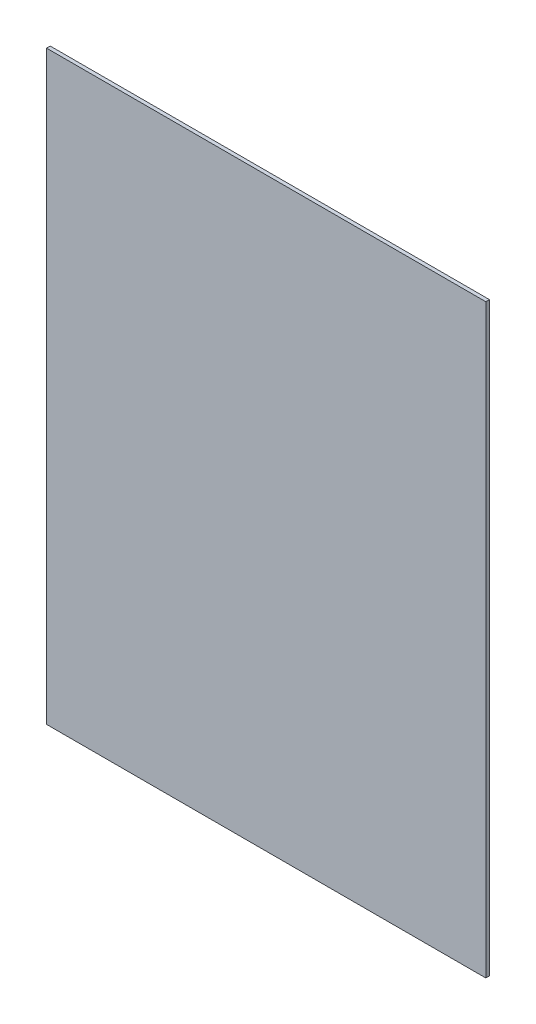
ISO-10303-21;
HEADER;
FILE_DESCRIPTION(('STEP AP214'),'2;1');
FILE_NAME('part.step','',(''),(''),'','','');
FILE_SCHEMA(('AUTOMOTIVE_DESIGN { 1 0 10303 214 1 1 1 1 }'));
ENDSEC;
DATA;
#1=APPLICATION_CONTEXT('core data for automotive mechanical design processes');
#2=APPLICATION_PROTOCOL_DEFINITION('international standard','automotive_design',2000,#1);
#3=PRODUCT_CONTEXT('',#1,'mechanical');
#4=PRODUCT('Part','Part','',(#3));
#5=PRODUCT_RELATED_PRODUCT_CATEGORY('part','',(#4));
#6=PRODUCT_DEFINITION_FORMATION('','',#4);
#7=PRODUCT_DEFINITION_CONTEXT('part definition',#1,'design');
#8=PRODUCT_DEFINITION('design','',#6,#7);
#9=PRODUCT_DEFINITION_SHAPE('','',#8);
#10=(LENGTH_UNIT() NAMED_UNIT(*) SI_UNIT(.MILLI.,.METRE.));
#11=(NAMED_UNIT(*) PLANE_ANGLE_UNIT() SI_UNIT($,.RADIAN.));
#12=(NAMED_UNIT(*) SI_UNIT($,.STERADIAN.) SOLID_ANGLE_UNIT());
#13=UNCERTAINTY_MEASURE_WITH_UNIT(LENGTH_MEASURE(1.E-05),#10,'distance_accuracy_value','');
#14=(GEOMETRIC_REPRESENTATION_CONTEXT(3) GLOBAL_UNCERTAINTY_ASSIGNED_CONTEXT((#13)) GLOBAL_UNIT_ASSIGNED_CONTEXT((#10,
#11,#12)) REPRESENTATION_CONTEXT('',''));
#15=CARTESIAN_POINT('',(0.,0.,0.));
#16=DIRECTION('',(0.,0.,1.));
#17=DIRECTION('',(1.,0.,0.));
#18=AXIS2_PLACEMENT_3D('',#15,#16,#17);
#19=CARTESIAN_POINT('',(0.,0.,5.));
#20=DIRECTION('',(1.,0.,0.));
#21=DIRECTION('',(0.,0.,-1.));
#22=AXIS2_PLACEMENT_3D('',#19,#20,#21);
#23=PLANE('',#22);
#24=DIRECTION('',(0.,-1.,0.));
#25=VECTOR('',#24,1.);
#26=CARTESIAN_POINT('',(0.,0.,0.));
#27=LINE('',#26,#25);
#28=CARTESIAN_POINT('',(0.,800.,0.));
#29=VERTEX_POINT('',#28);
#30=CARTESIAN_POINT('',(0.,0.,0.));
#31=VERTEX_POINT('',#30);
#32=EDGE_CURVE('E95',#29,#31,#27,.T.);
#33=ORIENTED_EDGE('',*,*,#32,.T.);
#34=DIRECTION('',(0.,0.,-1.));
#35=VECTOR('',#34,1.);
#36=CARTESIAN_POINT('',(0.,0.,5.));
#37=LINE('',#36,#35);
#38=CARTESIAN_POINT('',(0.,0.,5.));
#39=VERTEX_POINT('',#38);
#40=EDGE_CURVE('E11',#39,#31,#37,.T.);
#41=ORIENTED_EDGE('',*,*,#40,.F.);
#42=DIRECTION('',(0.,-1.,0.));
#43=VECTOR('',#42,1.);
#44=CARTESIAN_POINT('',(0.,0.,5.));
#45=LINE('',#44,#43);
#46=CARTESIAN_POINT('',(0.,800.,5.));
#47=VERTEX_POINT('',#46);
#48=EDGE_CURVE('E83',#47,#39,#45,.T.);
#49=ORIENTED_EDGE('',*,*,#48,.F.);
#50=DIRECTION('',(0.,0.,-1.));
#51=VECTOR('',#50,1.);
#52=CARTESIAN_POINT('',(0.,800.,5.));
#53=LINE('',#52,#51);
#54=EDGE_CURVE('E91',#47,#29,#53,.T.);
#55=ORIENTED_EDGE('',*,*,#54,.T.);
#56=EDGE_LOOP('',(#33,#41,#49,#55));
#57=FACE_BOUND('',#56,.T.);
#58=ADVANCED_FACE('F32',(#57),#23,.F.);
#59=CARTESIAN_POINT('',(0.,0.,5.));
#60=DIRECTION('',(0.,1.,0.));
#61=DIRECTION('',(0.,0.,1.));
#62=AXIS2_PLACEMENT_3D('',#59,#60,#61);
#63=PLANE('',#62);
#64=DIRECTION('',(1.,0.,0.));
#65=VECTOR('',#64,1.);
#66=CARTESIAN_POINT('',(0.,0.,0.));
#67=LINE('',#66,#65);
#68=CARTESIAN_POINT('',(600.,0.,0.));
#69=VERTEX_POINT('',#68);
#70=EDGE_CURVE('E87',#31,#69,#67,.T.);
#71=ORIENTED_EDGE('',*,*,#70,.T.);
#72=DIRECTION('',(0.,0.,-1.));
#73=VECTOR('',#72,1.);
#74=CARTESIAN_POINT('',(600.,0.,5.));
#75=LINE('',#74,#73);
#76=CARTESIAN_POINT('',(600.,0.,5.));
#77=VERTEX_POINT('',#76);
#78=EDGE_CURVE('E40',#77,#69,#75,.T.);
#79=ORIENTED_EDGE('',*,*,#78,.F.);
#80=DIRECTION('',(1.,0.,0.));
#81=VECTOR('',#80,1.);
#82=CARTESIAN_POINT('',(0.,0.,5.));
#83=LINE('',#82,#81);
#84=EDGE_CURVE('E78',#39,#77,#83,.T.);
#85=ORIENTED_EDGE('',*,*,#84,.F.);
#86=ORIENTED_EDGE('',*,*,#40,.T.);
#87=EDGE_LOOP('',(#71,#79,#85,#86));
#88=FACE_BOUND('',#87,.T.);
#89=ADVANCED_FACE('F86',(#88),#63,.F.);
#90=CARTESIAN_POINT('',(600.,0.,5.));
#91=DIRECTION('',(-1.,0.,0.));
#92=DIRECTION('',(0.,0.,1.));
#93=AXIS2_PLACEMENT_3D('',#90,#91,#92);
#94=PLANE('',#93);
#95=DIRECTION('',(0.,1.,0.));
#96=VECTOR('',#95,1.);
#97=CARTESIAN_POINT('',(600.,0.,0.));
#98=LINE('',#97,#96);
#99=CARTESIAN_POINT('',(600.,800.,0.));
#100=VERTEX_POINT('',#99);
#101=EDGE_CURVE('E65',#69,#100,#98,.T.);
#102=ORIENTED_EDGE('',*,*,#101,.T.);
#103=DIRECTION('',(0.,0.,-1.));
#104=VECTOR('',#103,1.);
#105=CARTESIAN_POINT('',(600.,800.,5.));
#106=LINE('',#105,#104);
#107=CARTESIAN_POINT('',(600.,800.,5.));
#108=VERTEX_POINT('',#107);
#109=EDGE_CURVE('E88',#108,#100,#106,.T.);
#110=ORIENTED_EDGE('',*,*,#109,.F.);
#111=DIRECTION('',(0.,1.,0.));
#112=VECTOR('',#111,1.);
#113=CARTESIAN_POINT('',(600.,0.,5.));
#114=LINE('',#113,#112);
#115=EDGE_CURVE('E81',#77,#108,#114,.T.);
#116=ORIENTED_EDGE('',*,*,#115,.F.);
#117=ORIENTED_EDGE('',*,*,#78,.T.);
#118=EDGE_LOOP('',(#102,#110,#116,#117));
#119=FACE_BOUND('',#118,.T.);
#120=ADVANCED_FACE('F89',(#119),#94,.F.);
#121=CARTESIAN_POINT('',(0.,800.,5.));
#122=DIRECTION('',(0.,-1.,0.));
#123=DIRECTION('',(0.,0.,-1.));
#124=AXIS2_PLACEMENT_3D('',#121,#122,#123);
#125=PLANE('',#124);
#126=DIRECTION('',(-1.,0.,0.));
#127=VECTOR('',#126,1.);
#128=CARTESIAN_POINT('',(0.,800.,0.));
#129=LINE('',#128,#127);
#130=EDGE_CURVE('E71',#100,#29,#129,.T.);
#131=ORIENTED_EDGE('',*,*,#130,.T.);
#132=ORIENTED_EDGE('',*,*,#54,.F.);
#133=DIRECTION('',(-1.,0.,0.));
#134=VECTOR('',#133,1.);
#135=CARTESIAN_POINT('',(0.,800.,5.));
#136=LINE('',#135,#134);
#137=EDGE_CURVE('E48',#108,#47,#136,.T.);
#138=ORIENTED_EDGE('',*,*,#137,.F.);
#139=ORIENTED_EDGE('',*,*,#109,.T.);
#140=EDGE_LOOP('',(#131,#132,#138,#139));
#141=FACE_BOUND('',#140,.T.);
#142=ADVANCED_FACE('F102',(#141),#125,.F.);
#143=CARTESIAN_POINT('',(0.,0.,5.));
#144=DIRECTION('',(0.,0.,-1.));
#145=DIRECTION('',(-1.,0.,0.));
#146=AXIS2_PLACEMENT_3D('',#143,#144,#145);
#147=PLANE('',#146);
#148=ORIENTED_EDGE('',*,*,#48,.T.);
#149=ORIENTED_EDGE('',*,*,#84,.T.);
#150=ORIENTED_EDGE('',*,*,#115,.T.);
#151=ORIENTED_EDGE('',*,*,#137,.T.);
#152=EDGE_LOOP('',(#148,#149,#150,#151));
#153=FACE_BOUND('',#152,.T.);
#154=ADVANCED_FACE('F79',(#153),#147,.F.);
#155=CARTESIAN_POINT('',(0.,0.,0.));
#156=DIRECTION('',(0.,0.,-1.));
#157=DIRECTION('',(-1.,0.,0.));
#158=AXIS2_PLACEMENT_3D('',#155,#156,#157);
#159=PLANE('',#158);
#160=ORIENTED_EDGE('',*,*,#32,.F.);
#161=ORIENTED_EDGE('',*,*,#130,.F.);
#162=ORIENTED_EDGE('',*,*,#101,.F.);
#163=ORIENTED_EDGE('',*,*,#70,.F.);
#164=EDGE_LOOP('',(#160,#161,#162,#163));
#165=FACE_BOUND('',#164,.T.);
#166=ADVANCED_FACE('F105',(#165),#159,.T.);
#167=CLOSED_SHELL('',(#58,#89,#120,#142,#154,#166));
#168=MANIFOLD_SOLID_BREP('B2',#167);
#169=ADVANCED_BREP_SHAPE_REPRESENTATION('',(#18,#168),#14);
#170=SHAPE_DEFINITION_REPRESENTATION(#9,#169);
ENDSEC;
END-ISO-10303-21;
